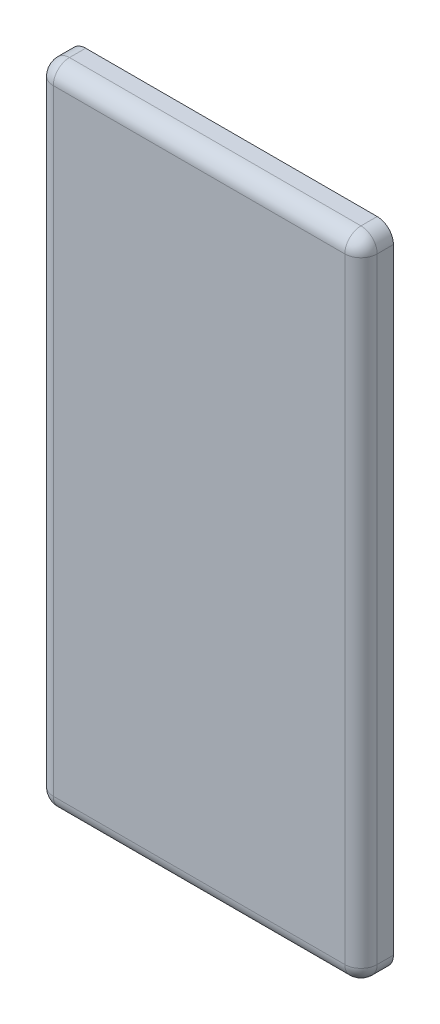
ISO-10303-21;
HEADER;
FILE_DESCRIPTION(('STEP AP214'),'2;1');
FILE_NAME('part.step','',(''),(''),'','','');
FILE_SCHEMA(('AUTOMOTIVE_DESIGN { 1 0 10303 214 1 1 1 1 }'));
ENDSEC;
DATA;
#1=APPLICATION_CONTEXT('core data for automotive mechanical design processes');
#2=APPLICATION_PROTOCOL_DEFINITION('international standard','automotive_design',2000,#1);
#3=PRODUCT_CONTEXT('',#1,'mechanical');
#4=PRODUCT('Part','Part','',(#3));
#5=PRODUCT_RELATED_PRODUCT_CATEGORY('part','',(#4));
#6=PRODUCT_DEFINITION_FORMATION('','',#4);
#7=PRODUCT_DEFINITION_CONTEXT('part definition',#1,'design');
#8=PRODUCT_DEFINITION('design','',#6,#7);
#9=PRODUCT_DEFINITION_SHAPE('','',#8);
#10=(LENGTH_UNIT() NAMED_UNIT(*) SI_UNIT(.MILLI.,.METRE.));
#11=(NAMED_UNIT(*) PLANE_ANGLE_UNIT() SI_UNIT($,.RADIAN.));
#12=(NAMED_UNIT(*) SI_UNIT($,.STERADIAN.) SOLID_ANGLE_UNIT());
#13=UNCERTAINTY_MEASURE_WITH_UNIT(LENGTH_MEASURE(1.E-05),#10,'distance_accuracy_value','');
#14=(GEOMETRIC_REPRESENTATION_CONTEXT(3) GLOBAL_UNCERTAINTY_ASSIGNED_CONTEXT((#13)) GLOBAL_UNIT_ASSIGNED_CONTEXT((#10,
#11,#12)) REPRESENTATION_CONTEXT('',''));
#15=CARTESIAN_POINT('',(0.,0.,0.));
#16=DIRECTION('',(0.,0.,1.));
#17=DIRECTION('',(1.,0.,0.));
#18=AXIS2_PLACEMENT_3D('',#15,#16,#17);
#19=CARTESIAN_POINT('',(10.,-20.,2.));
#20=DIRECTION('',(-1.,0.,0.));
#21=DIRECTION('',(0.,0.,1.));
#22=AXIS2_PLACEMENT_3D('',#19,#20,#21);
#23=PLANE('',#22);
#24=DIRECTION('',(0.,0.,-1.));
#25=VECTOR('',#24,1.);
#26=CARTESIAN_POINT('',(10.,19.,2.));
#27=LINE('',#26,#25);
#28=CARTESIAN_POINT('',(10.,19.,0.));
#29=VERTEX_POINT('',#28);
#30=CARTESIAN_POINT('',(10.,19.,1.));
#31=VERTEX_POINT('',#30);
#32=EDGE_CURVE('E157',#29,#31,#27,.F.);
#33=ORIENTED_EDGE('',*,*,#32,.T.);
#34=DIRECTION('',(0.,1.,0.));
#35=VECTOR('',#34,1.);
#36=CARTESIAN_POINT('',(10.,-20.,1.));
#37=LINE('',#36,#35);
#38=CARTESIAN_POINT('',(10.,-19.,1.));
#39=VERTEX_POINT('',#38);
#40=EDGE_CURVE('E176',#31,#39,#37,.F.);
#41=ORIENTED_EDGE('',*,*,#40,.T.);
#42=DIRECTION('',(0.,0.,-1.));
#43=VECTOR('',#42,1.);
#44=CARTESIAN_POINT('',(10.,-19.,2.));
#45=LINE('',#44,#43);
#46=CARTESIAN_POINT('',(10.,-19.,0.));
#47=VERTEX_POINT('',#46);
#48=EDGE_CURVE('E155',#39,#47,#45,.T.);
#49=ORIENTED_EDGE('',*,*,#48,.T.);
#50=DIRECTION('',(0.,1.,0.));
#51=VECTOR('',#50,1.);
#52=CARTESIAN_POINT('',(10.,-20.,0.));
#53=LINE('',#52,#51);
#54=EDGE_CURVE('E204',#47,#29,#53,.T.);
#55=ORIENTED_EDGE('',*,*,#54,.T.);
#56=EDGE_LOOP('',(#33,#41,#49,#55));
#57=FACE_BOUND('',#56,.T.);
#58=ADVANCED_FACE('F38',(#57),#23,.F.);
#59=CARTESIAN_POINT('',(-10.,20.,2.));
#60=DIRECTION('',(0.,-1.,0.));
#61=DIRECTION('',(0.,0.,-1.));
#62=AXIS2_PLACEMENT_3D('',#59,#60,#61);
#63=PLANE('',#62);
#64=DIRECTION('',(0.,0.,-1.));
#65=VECTOR('',#64,1.);
#66=CARTESIAN_POINT('',(-9.,20.,2.));
#67=LINE('',#66,#65);
#68=CARTESIAN_POINT('',(-9.,20.,0.));
#69=VERTEX_POINT('',#68);
#70=CARTESIAN_POINT('',(-9.,20.,1.));
#71=VERTEX_POINT('',#70);
#72=EDGE_CURVE('E152',#69,#71,#67,.F.);
#73=ORIENTED_EDGE('',*,*,#72,.T.);
#74=DIRECTION('',(-1.,0.,0.));
#75=VECTOR('',#74,1.);
#76=CARTESIAN_POINT('',(-10.,20.,1.));
#77=LINE('',#76,#75);
#78=CARTESIAN_POINT('',(9.,20.,1.));
#79=VERTEX_POINT('',#78);
#80=EDGE_CURVE('E172',#71,#79,#77,.F.);
#81=ORIENTED_EDGE('',*,*,#80,.T.);
#82=DIRECTION('',(0.,0.,-1.));
#83=VECTOR('',#82,1.);
#84=CARTESIAN_POINT('',(9.,20.,2.));
#85=LINE('',#84,#83);
#86=CARTESIAN_POINT('',(9.,20.,0.));
#87=VERTEX_POINT('',#86);
#88=EDGE_CURVE('E150',#79,#87,#85,.T.);
#89=ORIENTED_EDGE('',*,*,#88,.T.);
#90=DIRECTION('',(-1.,0.,0.));
#91=VECTOR('',#90,1.);
#92=CARTESIAN_POINT('',(-10.,20.,0.));
#93=LINE('',#92,#91);
#94=EDGE_CURVE('E140',#87,#69,#93,.T.);
#95=ORIENTED_EDGE('',*,*,#94,.T.);
#96=EDGE_LOOP('',(#73,#81,#89,#95));
#97=FACE_BOUND('',#96,.T.);
#98=ADVANCED_FACE('F216',(#97),#63,.F.);
#99=CARTESIAN_POINT('',(-10.,-20.,2.));
#100=DIRECTION('',(1.,0.,0.));
#101=DIRECTION('',(0.,0.,-1.));
#102=AXIS2_PLACEMENT_3D('',#99,#100,#101);
#103=PLANE('',#102);
#104=DIRECTION('',(0.,0.,-1.));
#105=VECTOR('',#104,1.);
#106=CARTESIAN_POINT('',(-10.,-19.,2.));
#107=LINE('',#106,#105);
#108=CARTESIAN_POINT('',(-10.,-19.,0.));
#109=VERTEX_POINT('',#108);
#110=CARTESIAN_POINT('',(-10.,-19.,1.));
#111=VERTEX_POINT('',#110);
#112=EDGE_CURVE('E127',#109,#111,#107,.F.);
#113=ORIENTED_EDGE('',*,*,#112,.T.);
#114=DIRECTION('',(0.,-1.,0.));
#115=VECTOR('',#114,1.);
#116=CARTESIAN_POINT('',(-10.,-20.,1.));
#117=LINE('',#116,#115);
#118=CARTESIAN_POINT('',(-10.,19.,1.));
#119=VERTEX_POINT('',#118);
#120=EDGE_CURVE('E11',#111,#119,#117,.F.);
#121=ORIENTED_EDGE('',*,*,#120,.T.);
#122=DIRECTION('',(0.,0.,-1.));
#123=VECTOR('',#122,1.);
#124=CARTESIAN_POINT('',(-10.,19.,2.));
#125=LINE('',#124,#123);
#126=CARTESIAN_POINT('',(-10.,19.,0.));
#127=VERTEX_POINT('',#126);
#128=EDGE_CURVE('E131',#119,#127,#125,.T.);
#129=ORIENTED_EDGE('',*,*,#128,.T.);
#130=DIRECTION('',(0.,-1.,0.));
#131=VECTOR('',#130,1.);
#132=CARTESIAN_POINT('',(-10.,-20.,0.));
#133=LINE('',#132,#131);
#134=EDGE_CURVE('E137',#127,#109,#133,.T.);
#135=ORIENTED_EDGE('',*,*,#134,.T.);
#136=EDGE_LOOP('',(#113,#121,#129,#135));
#137=FACE_BOUND('',#136,.T.);
#138=ADVANCED_FACE('F268',(#137),#103,.F.);
#139=CARTESIAN_POINT('',(-10.,-20.,2.));
#140=DIRECTION('',(0.,1.,0.));
#141=DIRECTION('',(0.,0.,1.));
#142=AXIS2_PLACEMENT_3D('',#139,#140,#141);
#143=PLANE('',#142);
#144=DIRECTION('',(0.,0.,-1.));
#145=VECTOR('',#144,1.);
#146=CARTESIAN_POINT('',(9.,-20.,2.));
#147=LINE('',#146,#145);
#148=CARTESIAN_POINT('',(9.,-20.,0.));
#149=VERTEX_POINT('',#148);
#150=CARTESIAN_POINT('',(9.,-20.,1.));
#151=VERTEX_POINT('',#150);
#152=EDGE_CURVE('E123',#149,#151,#147,.F.);
#153=ORIENTED_EDGE('',*,*,#152,.T.);
#154=DIRECTION('',(1.,0.,0.));
#155=VECTOR('',#154,1.);
#156=CARTESIAN_POINT('',(-10.,-20.,1.));
#157=LINE('',#156,#155);
#158=CARTESIAN_POINT('',(-9.,-20.,1.));
#159=VERTEX_POINT('',#158);
#160=EDGE_CURVE('E62',#151,#159,#157,.F.);
#161=ORIENTED_EDGE('',*,*,#160,.T.);
#162=DIRECTION('',(0.,0.,-1.));
#163=VECTOR('',#162,1.);
#164=CARTESIAN_POINT('',(-9.,-20.,2.));
#165=LINE('',#164,#163);
#166=CARTESIAN_POINT('',(-9.,-20.,0.));
#167=VERTEX_POINT('',#166);
#168=EDGE_CURVE('E115',#159,#167,#165,.T.);
#169=ORIENTED_EDGE('',*,*,#168,.T.);
#170=DIRECTION('',(1.,0.,0.));
#171=VECTOR('',#170,1.);
#172=CARTESIAN_POINT('',(-10.,-20.,0.));
#173=LINE('',#172,#171);
#174=EDGE_CURVE('E119',#167,#149,#173,.T.);
#175=ORIENTED_EDGE('',*,*,#174,.T.);
#176=EDGE_LOOP('',(#153,#161,#169,#175));
#177=FACE_BOUND('',#176,.T.);
#178=ADVANCED_FACE('F117',(#177),#143,.F.);
#179=CARTESIAN_POINT('',(0.,0.,2.));
#180=DIRECTION('',(0.,0.,-1.));
#181=DIRECTION('',(-1.,0.,0.));
#182=AXIS2_PLACEMENT_3D('',#179,#180,#181);
#183=PLANE('',#182);
#184=DIRECTION('',(0.,1.,0.));
#185=VECTOR('',#184,1.);
#186=CARTESIAN_POINT('',(9.00000000000001,0.,2.));
#187=LINE('',#186,#185);
#188=CARTESIAN_POINT('',(9.00000000000001,-19.,2.));
#189=VERTEX_POINT('',#188);
#190=CARTESIAN_POINT('',(9.00000000000001,19.,2.));
#191=VERTEX_POINT('',#190);
#192=EDGE_CURVE('E167',#189,#191,#187,.T.);
#193=ORIENTED_EDGE('',*,*,#192,.T.);
#194=DIRECTION('',(-1.,0.,0.));
#195=VECTOR('',#194,1.);
#196=CARTESIAN_POINT('',(0.,19.,2.));
#197=LINE('',#196,#195);
#198=CARTESIAN_POINT('',(-9.,19.,2.));
#199=VERTEX_POINT('',#198);
#200=EDGE_CURVE('E169',#191,#199,#197,.T.);
#201=ORIENTED_EDGE('',*,*,#200,.T.);
#202=DIRECTION('',(0.,-1.,0.));
#203=VECTOR('',#202,1.);
#204=CARTESIAN_POINT('',(-9.,0.,2.));
#205=LINE('',#204,#203);
#206=CARTESIAN_POINT('',(-9.,-19.,2.));
#207=VERTEX_POINT('',#206);
#208=EDGE_CURVE('E163',#199,#207,#205,.T.);
#209=ORIENTED_EDGE('',*,*,#208,.T.);
#210=DIRECTION('',(1.,0.,0.));
#211=VECTOR('',#210,1.);
#212=CARTESIAN_POINT('',(0.,-19.,2.));
#213=LINE('',#212,#211);
#214=EDGE_CURVE('E165',#207,#189,#213,.T.);
#215=ORIENTED_EDGE('',*,*,#214,.T.);
#216=EDGE_LOOP('',(#193,#201,#209,#215));
#217=FACE_BOUND('',#216,.T.);
#218=ADVANCED_FACE('F236',(#217),#183,.F.);
#219=CARTESIAN_POINT('',(0.,0.,0.));
#220=DIRECTION('',(0.,0.,-1.));
#221=DIRECTION('',(-1.,0.,0.));
#222=AXIS2_PLACEMENT_3D('',#219,#220,#221);
#223=PLANE('',#222);
#224=ORIENTED_EDGE('',*,*,#174,.F.);
#225=CARTESIAN_POINT('',(-9.,-19.,0.));
#226=DIRECTION('',(0.,0.,-1.));
#227=DIRECTION('',(-1.,0.,0.));
#228=AXIS2_PLACEMENT_3D('',#225,#226,#227);
#229=CIRCLE('',#228,1.);
#230=EDGE_CURVE('E125',#167,#109,#229,.T.);
#231=ORIENTED_EDGE('',*,*,#230,.T.);
#232=ORIENTED_EDGE('',*,*,#134,.F.);
#233=CARTESIAN_POINT('',(-9.,19.,0.));
#234=DIRECTION('',(0.,0.,-1.));
#235=DIRECTION('',(-1.,0.,0.));
#236=AXIS2_PLACEMENT_3D('',#233,#234,#235);
#237=CIRCLE('',#236,1.);
#238=EDGE_CURVE('E132',#127,#69,#237,.T.);
#239=ORIENTED_EDGE('',*,*,#238,.T.);
#240=ORIENTED_EDGE('',*,*,#94,.F.);
#241=CARTESIAN_POINT('',(9.,19.,0.));
#242=DIRECTION('',(0.,0.,-1.));
#243=DIRECTION('',(-1.,0.,0.));
#244=AXIS2_PLACEMENT_3D('',#241,#242,#243);
#245=CIRCLE('',#244,1.);
#246=EDGE_CURVE('E145',#87,#29,#245,.T.);
#247=ORIENTED_EDGE('',*,*,#246,.T.);
#248=ORIENTED_EDGE('',*,*,#54,.F.);
#249=CARTESIAN_POINT('',(9.00000000000001,-19.,0.));
#250=DIRECTION('',(0.,0.,-1.));
#251=DIRECTION('',(-1.,0.,0.));
#252=AXIS2_PLACEMENT_3D('',#249,#250,#251);
#253=CIRCLE('',#252,1.);
#254=EDGE_CURVE('E122',#47,#149,#253,.T.);
#255=ORIENTED_EDGE('',*,*,#254,.T.);
#256=EDGE_LOOP('',(#224,#231,#232,#239,#240,#247,#248,#255));
#257=FACE_BOUND('',#256,.T.);
#258=ADVANCED_FACE('F134',(#257),#223,.T.);
#259=CARTESIAN_POINT('',(-9.,-19.,2.));
#260=DIRECTION('',(0.,0.,-1.));
#261=DIRECTION('',(-1.,0.,0.));
#262=AXIS2_PLACEMENT_3D('',#259,#260,#261);
#263=CYLINDRICAL_SURFACE('',#262,1.);
#264=ORIENTED_EDGE('',*,*,#168,.F.);
#265=CARTESIAN_POINT('',(-9.,-19.,1.));
#266=DIRECTION('',(0.,0.,-1.));
#267=DIRECTION('',(-1.,0.,0.));
#268=AXIS2_PLACEMENT_3D('',#265,#266,#267);
#269=CIRCLE('',#268,1.);
#270=EDGE_CURVE('E47',#159,#111,#269,.T.);
#271=ORIENTED_EDGE('',*,*,#270,.T.);
#272=ORIENTED_EDGE('',*,*,#112,.F.);
#273=ORIENTED_EDGE('',*,*,#230,.F.);
#274=EDGE_LOOP('',(#264,#271,#272,#273));
#275=FACE_BOUND('',#274,.T.);
#276=ADVANCED_FACE('F126',(#275),#263,.T.);
#277=CARTESIAN_POINT('',(-9.,19.,2.));
#278=DIRECTION('',(0.,0.,-1.));
#279=DIRECTION('',(-1.,0.,0.));
#280=AXIS2_PLACEMENT_3D('',#277,#278,#279);
#281=CYLINDRICAL_SURFACE('',#280,1.);
#282=ORIENTED_EDGE('',*,*,#128,.F.);
#283=CARTESIAN_POINT('',(-9.,19.,1.));
#284=DIRECTION('',(0.,0.,-1.));
#285=DIRECTION('',(-1.,0.,0.));
#286=AXIS2_PLACEMENT_3D('',#283,#284,#285);
#287=CIRCLE('',#286,1.);
#288=EDGE_CURVE('E160',#119,#71,#287,.T.);
#289=ORIENTED_EDGE('',*,*,#288,.T.);
#290=ORIENTED_EDGE('',*,*,#72,.F.);
#291=ORIENTED_EDGE('',*,*,#238,.F.);
#292=EDGE_LOOP('',(#282,#289,#290,#291));
#293=FACE_BOUND('',#292,.T.);
#294=ADVANCED_FACE('F222',(#293),#281,.T.);
#295=CARTESIAN_POINT('',(9.,19.,2.));
#296=DIRECTION('',(0.,0.,-1.));
#297=DIRECTION('',(-1.,0.,0.));
#298=AXIS2_PLACEMENT_3D('',#295,#296,#297);
#299=CYLINDRICAL_SURFACE('',#298,1.);
#300=ORIENTED_EDGE('',*,*,#88,.F.);
#301=CARTESIAN_POINT('',(9.,19.,1.));
#302=DIRECTION('',(0.,0.,-1.));
#303=DIRECTION('',(-1.,0.,0.));
#304=AXIS2_PLACEMENT_3D('',#301,#302,#303);
#305=CIRCLE('',#304,1.);
#306=EDGE_CURVE('E174',#79,#31,#305,.T.);
#307=ORIENTED_EDGE('',*,*,#306,.T.);
#308=ORIENTED_EDGE('',*,*,#32,.F.);
#309=ORIENTED_EDGE('',*,*,#246,.F.);
#310=EDGE_LOOP('',(#300,#307,#308,#309));
#311=FACE_BOUND('',#310,.T.);
#312=ADVANCED_FACE('F243',(#311),#299,.T.);
#313=CARTESIAN_POINT('',(9.00000000000001,-19.,2.));
#314=DIRECTION('',(0.,0.,-1.));
#315=DIRECTION('',(-1.,0.,0.));
#316=AXIS2_PLACEMENT_3D('',#313,#314,#315);
#317=CYLINDRICAL_SURFACE('',#316,1.);
#318=ORIENTED_EDGE('',*,*,#48,.F.);
#319=CARTESIAN_POINT('',(9.00000000000001,-19.,1.));
#320=DIRECTION('',(0.,0.,-1.));
#321=DIRECTION('',(-1.,0.,0.));
#322=AXIS2_PLACEMENT_3D('',#319,#320,#321);
#323=CIRCLE('',#322,1.);
#324=EDGE_CURVE('E178',#39,#151,#323,.T.);
#325=ORIENTED_EDGE('',*,*,#324,.T.);
#326=ORIENTED_EDGE('',*,*,#152,.F.);
#327=ORIENTED_EDGE('',*,*,#254,.F.);
#328=EDGE_LOOP('',(#318,#325,#326,#327));
#329=FACE_BOUND('',#328,.T.);
#330=ADVANCED_FACE('F250',(#329),#317,.T.);
#331=CARTESIAN_POINT('',(9.00000000000001,-19.,1.));
#332=DIRECTION('',(0.,0.,-1.));
#333=DIRECTION('',(-1.,0.,0.));
#334=AXIS2_PLACEMENT_3D('',#331,#332,#333);
#335=SPHERICAL_SURFACE('',#334,1.);
#336=CARTESIAN_POINT('',(9.00000000000001,-19.,1.));
#337=DIRECTION('',(-1.,0.,0.));
#338=DIRECTION('',(0.,-1.,0.));
#339=AXIS2_PLACEMENT_3D('',#336,#337,#338);
#340=CIRCLE('',#339,1.);
#341=EDGE_CURVE('E197',#151,#189,#340,.T.);
#342=ORIENTED_EDGE('',*,*,#341,.F.);
#343=ORIENTED_EDGE('',*,*,#324,.F.);
#344=CARTESIAN_POINT('',(9.00000000000001,-19.,1.));
#345=DIRECTION('',(0.,1.,0.));
#346=DIRECTION('',(0.,0.,1.));
#347=AXIS2_PLACEMENT_3D('',#344,#345,#346);
#348=CIRCLE('',#347,1.);
#349=EDGE_CURVE('E42',#189,#39,#348,.T.);
#350=ORIENTED_EDGE('',*,*,#349,.F.);
#351=EDGE_LOOP('',(#342,#343,#350));
#352=FACE_BOUND('',#351,.T.);
#353=ADVANCED_FACE('F40',(#352),#335,.T.);
#354=CARTESIAN_POINT('',(9.00000000000001,0.,1.));
#355=DIRECTION('',(0.,1.,0.));
#356=DIRECTION('',(0.,0.,1.));
#357=AXIS2_PLACEMENT_3D('',#354,#355,#356);
#358=CYLINDRICAL_SURFACE('',#357,1.);
#359=ORIENTED_EDGE('',*,*,#349,.T.);
#360=ORIENTED_EDGE('',*,*,#40,.F.);
#361=CARTESIAN_POINT('',(9.00000000000001,19.,1.));
#362=DIRECTION('',(0.,1.,0.));
#363=DIRECTION('',(0.,0.,1.));
#364=AXIS2_PLACEMENT_3D('',#361,#362,#363);
#365=CIRCLE('',#364,1.);
#366=EDGE_CURVE('E195',#191,#31,#365,.T.);
#367=ORIENTED_EDGE('',*,*,#366,.F.);
#368=ORIENTED_EDGE('',*,*,#192,.F.);
#369=EDGE_LOOP('',(#359,#360,#367,#368));
#370=FACE_BOUND('',#369,.T.);
#371=ADVANCED_FACE('F246',(#370),#358,.T.);
#372=CARTESIAN_POINT('',(0.,-19.,1.));
#373=DIRECTION('',(1.,0.,0.));
#374=DIRECTION('',(0.,0.,-1.));
#375=AXIS2_PLACEMENT_3D('',#372,#373,#374);
#376=CYLINDRICAL_SURFACE('',#375,1.);
#377=ORIENTED_EDGE('',*,*,#341,.T.);
#378=ORIENTED_EDGE('',*,*,#214,.F.);
#379=CARTESIAN_POINT('',(-9.,-19.,1.));
#380=DIRECTION('',(-1.,0.,0.));
#381=DIRECTION('',(0.,0.,1.));
#382=AXIS2_PLACEMENT_3D('',#379,#380,#381);
#383=CIRCLE('',#382,1.);
#384=EDGE_CURVE('E192',#159,#207,#383,.T.);
#385=ORIENTED_EDGE('',*,*,#384,.F.);
#386=ORIENTED_EDGE('',*,*,#160,.F.);
#387=EDGE_LOOP('',(#377,#378,#385,#386));
#388=FACE_BOUND('',#387,.T.);
#389=ADVANCED_FACE('F252',(#388),#376,.T.);
#390=CARTESIAN_POINT('',(9.,19.,1.));
#391=DIRECTION('',(0.,0.,-1.));
#392=DIRECTION('',(-1.,0.,0.));
#393=AXIS2_PLACEMENT_3D('',#390,#391,#392);
#394=SPHERICAL_SURFACE('',#393,1.);
#395=ORIENTED_EDGE('',*,*,#366,.T.);
#396=ORIENTED_EDGE('',*,*,#306,.F.);
#397=CARTESIAN_POINT('',(9.,19.,1.));
#398=DIRECTION('',(-1.,0.,0.));
#399=DIRECTION('',(0.,0.,1.));
#400=AXIS2_PLACEMENT_3D('',#397,#398,#399);
#401=CIRCLE('',#400,1.);
#402=EDGE_CURVE('E189',#191,#79,#401,.T.);
#403=ORIENTED_EDGE('',*,*,#402,.F.);
#404=EDGE_LOOP('',(#395,#396,#403));
#405=FACE_BOUND('',#404,.T.);
#406=ADVANCED_FACE('F245',(#405),#394,.T.);
#407=CARTESIAN_POINT('',(-9.,-19.,1.));
#408=DIRECTION('',(0.,0.,-1.));
#409=DIRECTION('',(-1.,0.,0.));
#410=AXIS2_PLACEMENT_3D('',#407,#408,#409);
#411=SPHERICAL_SURFACE('',#410,1.);
#412=ORIENTED_EDGE('',*,*,#270,.F.);
#413=ORIENTED_EDGE('',*,*,#384,.T.);
#414=CARTESIAN_POINT('',(-9.,-19.,1.));
#415=DIRECTION('',(0.,1.,0.));
#416=DIRECTION('',(0.,0.,1.));
#417=AXIS2_PLACEMENT_3D('',#414,#415,#416);
#418=CIRCLE('',#417,1.);
#419=EDGE_CURVE('E186',#111,#207,#418,.T.);
#420=ORIENTED_EDGE('',*,*,#419,.F.);
#421=EDGE_LOOP('',(#412,#413,#420));
#422=FACE_BOUND('',#421,.T.);
#423=ADVANCED_FACE('F254',(#422),#411,.T.);
#424=CARTESIAN_POINT('',(0.,19.,1.));
#425=DIRECTION('',(-1.,0.,0.));
#426=DIRECTION('',(0.,0.,1.));
#427=AXIS2_PLACEMENT_3D('',#424,#425,#426);
#428=CYLINDRICAL_SURFACE('',#427,1.);
#429=ORIENTED_EDGE('',*,*,#402,.T.);
#430=ORIENTED_EDGE('',*,*,#80,.F.);
#431=CARTESIAN_POINT('',(-9.,19.,1.));
#432=DIRECTION('',(-1.,0.,0.));
#433=DIRECTION('',(0.,0.,1.));
#434=AXIS2_PLACEMENT_3D('',#431,#432,#433);
#435=CIRCLE('',#434,1.);
#436=EDGE_CURVE('E184',#199,#71,#435,.T.);
#437=ORIENTED_EDGE('',*,*,#436,.F.);
#438=ORIENTED_EDGE('',*,*,#200,.F.);
#439=EDGE_LOOP('',(#429,#430,#437,#438));
#440=FACE_BOUND('',#439,.T.);
#441=ADVANCED_FACE('F239',(#440),#428,.T.);
#442=CARTESIAN_POINT('',(-9.,0.,1.));
#443=DIRECTION('',(0.,-1.,0.));
#444=DIRECTION('',(0.,0.,-1.));
#445=AXIS2_PLACEMENT_3D('',#442,#443,#444);
#446=CYLINDRICAL_SURFACE('',#445,1.);
#447=ORIENTED_EDGE('',*,*,#419,.T.);
#448=ORIENTED_EDGE('',*,*,#208,.F.);
#449=CARTESIAN_POINT('',(-9.,19.,1.));
#450=DIRECTION('',(0.,1.,0.));
#451=DIRECTION('',(0.,0.,1.));
#452=AXIS2_PLACEMENT_3D('',#449,#450,#451);
#453=CIRCLE('',#452,1.);
#454=EDGE_CURVE('E182',#119,#199,#453,.T.);
#455=ORIENTED_EDGE('',*,*,#454,.F.);
#456=ORIENTED_EDGE('',*,*,#120,.F.);
#457=EDGE_LOOP('',(#447,#448,#455,#456));
#458=FACE_BOUND('',#457,.T.);
#459=ADVANCED_FACE('F232',(#458),#446,.T.);
#460=CARTESIAN_POINT('',(-9.,19.,1.));
#461=DIRECTION('',(0.,0.,-1.));
#462=DIRECTION('',(-1.,0.,0.));
#463=AXIS2_PLACEMENT_3D('',#460,#461,#462);
#464=SPHERICAL_SURFACE('',#463,1.);
#465=ORIENTED_EDGE('',*,*,#436,.T.);
#466=ORIENTED_EDGE('',*,*,#288,.F.);
#467=ORIENTED_EDGE('',*,*,#454,.T.);
#468=EDGE_LOOP('',(#465,#466,#467));
#469=FACE_BOUND('',#468,.T.);
#470=ADVANCED_FACE('F226',(#469),#464,.T.);
#471=CLOSED_SHELL('',(#58,#98,#138,#178,#218,#258,#276,#294,#312,#330,#353,#371,#389,#406,#423,
#441,#459,#470));
#472=MANIFOLD_SOLID_BREP('B2',#471);
#473=ADVANCED_BREP_SHAPE_REPRESENTATION('',(#18,#472),#14);
#474=SHAPE_DEFINITION_REPRESENTATION(#9,#473);
ENDSEC;
END-ISO-10303-21;
